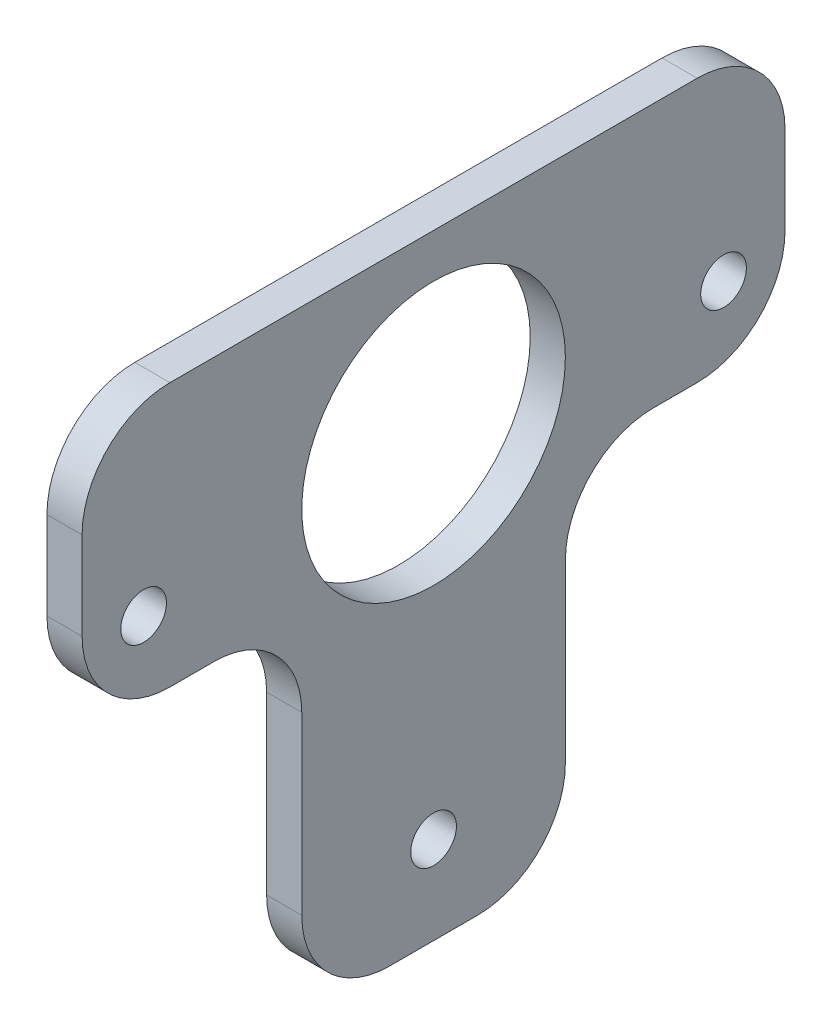
ISO-10303-21;
HEADER;
FILE_DESCRIPTION(('STEP AP214'),'2;1');
FILE_NAME('part.step','',(''),(''),'','','');
FILE_SCHEMA(('AUTOMOTIVE_DESIGN { 1 0 10303 214 1 1 1 1 }'));
ENDSEC;
DATA;
#1=APPLICATION_CONTEXT('core data for automotive mechanical design processes');
#2=APPLICATION_PROTOCOL_DEFINITION('international standard','automotive_design',2000,#1);
#3=PRODUCT_CONTEXT('',#1,'mechanical');
#4=PRODUCT('Part','Part','',(#3));
#5=PRODUCT_RELATED_PRODUCT_CATEGORY('part','',(#4));
#6=PRODUCT_DEFINITION_FORMATION('','',#4);
#7=PRODUCT_DEFINITION_CONTEXT('part definition',#1,'design');
#8=PRODUCT_DEFINITION('design','',#6,#7);
#9=PRODUCT_DEFINITION_SHAPE('','',#8);
#10=(LENGTH_UNIT() NAMED_UNIT(*) SI_UNIT(.MILLI.,.METRE.));
#11=(NAMED_UNIT(*) PLANE_ANGLE_UNIT() SI_UNIT($,.RADIAN.));
#12=(NAMED_UNIT(*) SI_UNIT($,.STERADIAN.) SOLID_ANGLE_UNIT());
#13=UNCERTAINTY_MEASURE_WITH_UNIT(LENGTH_MEASURE(1.E-05),#10,'distance_accuracy_value','');
#14=(GEOMETRIC_REPRESENTATION_CONTEXT(3) GLOBAL_UNCERTAINTY_ASSIGNED_CONTEXT((#13)) GLOBAL_UNIT_ASSIGNED_CONTEXT((#10,
#11,#12)) REPRESENTATION_CONTEXT('',''));
#15=CARTESIAN_POINT('',(0.,0.,0.));
#16=DIRECTION('',(0.,0.,1.));
#17=DIRECTION('',(1.,0.,0.));
#18=AXIS2_PLACEMENT_3D('',#15,#16,#17);
#19=CARTESIAN_POINT('',(4.,15.,40.));
#20=DIRECTION('',(0.,0.,-1.));
#21=DIRECTION('',(0.,1.,0.));
#22=AXIS2_PLACEMENT_3D('',#19,#20,#21);
#23=PLANE('',#22);
#24=DIRECTION('',(0.,-1.,0.));
#25=VECTOR('',#24,1.);
#26=CARTESIAN_POINT('',(0.,15.,40.));
#27=LINE('',#26,#25);
#28=CARTESIAN_POINT('',(0.,4.99999999999999,40.));
#29=VERTEX_POINT('',#28);
#30=CARTESIAN_POINT('',(0.,-5.,40.));
#31=VERTEX_POINT('',#30);
#32=EDGE_CURVE('E201',#29,#31,#27,.T.);
#33=ORIENTED_EDGE('',*,*,#32,.T.);
#34=DIRECTION('',(-1.,0.,0.));
#35=VECTOR('',#34,1.);
#36=CARTESIAN_POINT('',(4.,-5.,40.));
#37=LINE('',#36,#35);
#38=CARTESIAN_POINT('',(4.,-5.,40.));
#39=VERTEX_POINT('',#38);
#40=EDGE_CURVE('E252',#31,#39,#37,.F.);
#41=ORIENTED_EDGE('',*,*,#40,.T.);
#42=DIRECTION('',(0.,-1.,0.));
#43=VECTOR('',#42,1.);
#44=CARTESIAN_POINT('',(4.,15.,40.));
#45=LINE('',#44,#43);
#46=CARTESIAN_POINT('',(4.,4.99999999999999,40.));
#47=VERTEX_POINT('',#46);
#48=EDGE_CURVE('E187',#47,#39,#45,.T.);
#49=ORIENTED_EDGE('',*,*,#48,.F.);
#50=DIRECTION('',(-1.,0.,0.));
#51=VECTOR('',#50,1.);
#52=CARTESIAN_POINT('',(4.,4.99999999999999,40.));
#53=LINE('',#52,#51);
#54=EDGE_CURVE('E249',#47,#29,#53,.T.);
#55=ORIENTED_EDGE('',*,*,#54,.T.);
#56=EDGE_LOOP('',(#33,#41,#49,#55));
#57=FACE_BOUND('',#56,.T.);
#58=ADVANCED_FACE('F35',(#57),#23,.F.);
#59=CARTESIAN_POINT('',(4.,-15.,40.));
#60=DIRECTION('',(0.,1.,0.));
#61=DIRECTION('',(0.,0.,1.));
#62=AXIS2_PLACEMENT_3D('',#59,#60,#61);
#63=PLANE('',#62);
#64=DIRECTION('',(0.,0.,-1.));
#65=VECTOR('',#64,1.);
#66=CARTESIAN_POINT('',(0.,-15.,40.));
#67=LINE('',#66,#65);
#68=CARTESIAN_POINT('',(0.,-15.,30.));
#69=VERTEX_POINT('',#68);
#70=CARTESIAN_POINT('',(0.,-15.,25.));
#71=VERTEX_POINT('',#70);
#72=EDGE_CURVE('E260',#69,#71,#67,.T.);
#73=ORIENTED_EDGE('',*,*,#72,.T.);
#74=DIRECTION('',(-1.,0.,0.));
#75=VECTOR('',#74,1.);
#76=CARTESIAN_POINT('',(4.,-15.,25.));
#77=LINE('',#76,#75);
#78=CARTESIAN_POINT('',(4.,-15.,25.));
#79=VERTEX_POINT('',#78);
#80=EDGE_CURVE('E247',#71,#79,#77,.F.);
#81=ORIENTED_EDGE('',*,*,#80,.T.);
#82=DIRECTION('',(0.,0.,-1.));
#83=VECTOR('',#82,1.);
#84=CARTESIAN_POINT('',(4.,-15.,40.));
#85=LINE('',#84,#83);
#86=CARTESIAN_POINT('',(4.,-15.,30.));
#87=VERTEX_POINT('',#86);
#88=EDGE_CURVE('E279',#87,#79,#85,.T.);
#89=ORIENTED_EDGE('',*,*,#88,.F.);
#90=DIRECTION('',(-1.,0.,0.));
#91=VECTOR('',#90,1.);
#92=CARTESIAN_POINT('',(4.,-15.,30.));
#93=LINE('',#92,#91);
#94=EDGE_CURVE('E244',#87,#69,#93,.T.);
#95=ORIENTED_EDGE('',*,*,#94,.T.);
#96=EDGE_LOOP('',(#73,#81,#89,#95));
#97=FACE_BOUND('',#96,.T.);
#98=ADVANCED_FACE('F267',(#97),#63,.F.);
#99=CARTESIAN_POINT('',(4.,-15.,15.));
#100=DIRECTION('',(0.,0.,-1.));
#101=DIRECTION('',(-1.,0.,0.));
#102=AXIS2_PLACEMENT_3D('',#99,#100,#101);
#103=PLANE('',#102);
#104=DIRECTION('',(0.,-1.,0.));
#105=VECTOR('',#104,1.);
#106=CARTESIAN_POINT('',(0.,-15.,15.));
#107=LINE('',#106,#105);
#108=CARTESIAN_POINT('',(0.,-25.,15.));
#109=VERTEX_POINT('',#108);
#110=CARTESIAN_POINT('',(0.,-45.,15.));
#111=VERTEX_POINT('',#110);
#112=EDGE_CURVE('E262',#109,#111,#107,.T.);
#113=ORIENTED_EDGE('',*,*,#112,.T.);
#114=DIRECTION('',(-1.,0.,0.));
#115=VECTOR('',#114,1.);
#116=CARTESIAN_POINT('',(4.,-45.,15.));
#117=LINE('',#116,#115);
#118=CARTESIAN_POINT('',(4.,-45.,15.));
#119=VERTEX_POINT('',#118);
#120=EDGE_CURVE('E242',#111,#119,#117,.F.);
#121=ORIENTED_EDGE('',*,*,#120,.T.);
#122=DIRECTION('',(0.,-1.,0.));
#123=VECTOR('',#122,1.);
#124=CARTESIAN_POINT('',(4.,-15.,15.));
#125=LINE('',#124,#123);
#126=CARTESIAN_POINT('',(4.,-25.,15.));
#127=VERTEX_POINT('',#126);
#128=EDGE_CURVE('E277',#127,#119,#125,.T.);
#129=ORIENTED_EDGE('',*,*,#128,.F.);
#130=DIRECTION('',(-1.,0.,0.));
#131=VECTOR('',#130,1.);
#132=CARTESIAN_POINT('',(0.,-25.,15.));
#133=LINE('',#132,#131);
#134=EDGE_CURVE('E239',#127,#109,#133,.T.);
#135=ORIENTED_EDGE('',*,*,#134,.T.);
#136=EDGE_LOOP('',(#113,#121,#129,#135));
#137=FACE_BOUND('',#136,.T.);
#138=ADVANCED_FACE('F281',(#137),#103,.F.);
#139=CARTESIAN_POINT('',(4.,-55.,15.));
#140=DIRECTION('',(0.,1.,0.));
#141=DIRECTION('',(0.,0.,1.));
#142=AXIS2_PLACEMENT_3D('',#139,#140,#141);
#143=PLANE('',#142);
#144=DIRECTION('',(0.,0.,-1.));
#145=VECTOR('',#144,1.);
#146=CARTESIAN_POINT('',(0.,-55.,15.));
#147=LINE('',#146,#145);
#148=CARTESIAN_POINT('',(0.,-55.,4.99999999999999));
#149=VERTEX_POINT('',#148);
#150=CARTESIAN_POINT('',(0.,-55.,-5.00000000000001));
#151=VERTEX_POINT('',#150);
#152=EDGE_CURVE('E182',#149,#151,#147,.T.);
#153=ORIENTED_EDGE('',*,*,#152,.T.);
#154=DIRECTION('',(-1.,0.,0.));
#155=VECTOR('',#154,1.);
#156=CARTESIAN_POINT('',(4.,-55.,-5.00000000000001));
#157=LINE('',#156,#155);
#158=CARTESIAN_POINT('',(4.,-55.,-5.00000000000001));
#159=VERTEX_POINT('',#158);
#160=EDGE_CURVE('E237',#151,#159,#157,.F.);
#161=ORIENTED_EDGE('',*,*,#160,.T.);
#162=DIRECTION('',(0.,0.,-1.));
#163=VECTOR('',#162,1.);
#164=CARTESIAN_POINT('',(4.,-55.,15.));
#165=LINE('',#164,#163);
#166=CARTESIAN_POINT('',(4.,-55.,4.99999999999999));
#167=VERTEX_POINT('',#166);
#168=EDGE_CURVE('E283',#167,#159,#165,.T.);
#169=ORIENTED_EDGE('',*,*,#168,.F.);
#170=DIRECTION('',(-1.,0.,0.));
#171=VECTOR('',#170,1.);
#172=CARTESIAN_POINT('',(4.,-55.,4.99999999999999));
#173=LINE('',#172,#171);
#174=EDGE_CURVE('E234',#167,#149,#173,.T.);
#175=ORIENTED_EDGE('',*,*,#174,.T.);
#176=EDGE_LOOP('',(#153,#161,#169,#175));
#177=FACE_BOUND('',#176,.T.);
#178=ADVANCED_FACE('F303',(#177),#143,.F.);
#179=CARTESIAN_POINT('',(4.,-55.,-15.));
#180=DIRECTION('',(0.,0.,1.));
#181=DIRECTION('',(1.,0.,0.));
#182=AXIS2_PLACEMENT_3D('',#179,#180,#181);
#183=PLANE('',#182);
#184=DIRECTION('',(0.,1.,0.));
#185=VECTOR('',#184,1.);
#186=CARTESIAN_POINT('',(0.,-55.,-15.));
#187=LINE('',#186,#185);
#188=CARTESIAN_POINT('',(0.,-45.,-15.));
#189=VERTEX_POINT('',#188);
#190=CARTESIAN_POINT('',(0.,-25.,-15.));
#191=VERTEX_POINT('',#190);
#192=EDGE_CURVE('E177',#189,#191,#187,.T.);
#193=ORIENTED_EDGE('',*,*,#192,.T.);
#194=DIRECTION('',(-1.,0.,0.));
#195=VECTOR('',#194,1.);
#196=CARTESIAN_POINT('',(4.,-25.,-15.));
#197=LINE('',#196,#195);
#198=CARTESIAN_POINT('',(4.,-25.,-15.));
#199=VERTEX_POINT('',#198);
#200=EDGE_CURVE('E154',#191,#199,#197,.F.);
#201=ORIENTED_EDGE('',*,*,#200,.T.);
#202=DIRECTION('',(0.,1.,0.));
#203=VECTOR('',#202,1.);
#204=CARTESIAN_POINT('',(4.,-55.,-15.));
#205=LINE('',#204,#203);
#206=CARTESIAN_POINT('',(4.,-45.,-15.));
#207=VERTEX_POINT('',#206);
#208=EDGE_CURVE('E286',#207,#199,#205,.T.);
#209=ORIENTED_EDGE('',*,*,#208,.F.);
#210=DIRECTION('',(-1.,0.,0.));
#211=VECTOR('',#210,1.);
#212=CARTESIAN_POINT('',(4.,-45.,-15.));
#213=LINE('',#212,#211);
#214=EDGE_CURVE('E170',#207,#189,#213,.T.);
#215=ORIENTED_EDGE('',*,*,#214,.T.);
#216=EDGE_LOOP('',(#193,#201,#209,#215));
#217=FACE_BOUND('',#216,.T.);
#218=ADVANCED_FACE('F312',(#217),#183,.F.);
#219=CARTESIAN_POINT('',(4.,-15.,-15.));
#220=DIRECTION('',(0.,1.,0.));
#221=DIRECTION('',(0.,0.,1.));
#222=AXIS2_PLACEMENT_3D('',#219,#220,#221);
#223=PLANE('',#222);
#224=DIRECTION('',(0.,0.,-1.));
#225=VECTOR('',#224,1.);
#226=CARTESIAN_POINT('',(4.,-15.,-15.));
#227=LINE('',#226,#225);
#228=CARTESIAN_POINT('',(4.,-15.,-25.));
#229=VERTEX_POINT('',#228);
#230=CARTESIAN_POINT('',(4.,-15.,-30.));
#231=VERTEX_POINT('',#230);
#232=EDGE_CURVE('E169',#229,#231,#227,.T.);
#233=ORIENTED_EDGE('',*,*,#232,.F.);
#234=DIRECTION('',(-1.,0.,0.));
#235=VECTOR('',#234,1.);
#236=CARTESIAN_POINT('',(0.,-15.,-25.));
#237=LINE('',#236,#235);
#238=CARTESIAN_POINT('',(0.,-15.,-25.));
#239=VERTEX_POINT('',#238);
#240=EDGE_CURVE('E153',#229,#239,#237,.T.);
#241=ORIENTED_EDGE('',*,*,#240,.T.);
#242=DIRECTION('',(0.,0.,-1.));
#243=VECTOR('',#242,1.);
#244=CARTESIAN_POINT('',(0.,-15.,-15.));
#245=LINE('',#244,#243);
#246=CARTESIAN_POINT('',(0.,-15.,-30.));
#247=VERTEX_POINT('',#246);
#248=EDGE_CURVE('E166',#239,#247,#245,.T.);
#249=ORIENTED_EDGE('',*,*,#248,.T.);
#250=DIRECTION('',(-1.,0.,0.));
#251=VECTOR('',#250,1.);
#252=CARTESIAN_POINT('',(4.,-15.,-30.));
#253=LINE('',#252,#251);
#254=EDGE_CURVE('E171',#247,#231,#253,.F.);
#255=ORIENTED_EDGE('',*,*,#254,.T.);
#256=EDGE_LOOP('',(#233,#241,#249,#255));
#257=FACE_BOUND('',#256,.T.);
#258=ADVANCED_FACE('F165',(#257),#223,.F.);
#259=CARTESIAN_POINT('',(4.,15.,-40.));
#260=DIRECTION('',(0.,0.,1.));
#261=DIRECTION('',(0.,-1.,0.));
#262=AXIS2_PLACEMENT_3D('',#259,#260,#261);
#263=PLANE('',#262);
#264=DIRECTION('',(0.,1.,0.));
#265=VECTOR('',#264,1.);
#266=CARTESIAN_POINT('',(4.,15.,-40.));
#267=LINE('',#266,#265);
#268=CARTESIAN_POINT('',(4.,-4.99999999999999,-40.));
#269=VERTEX_POINT('',#268);
#270=CARTESIAN_POINT('',(4.,5.00000000000001,-40.));
#271=VERTEX_POINT('',#270);
#272=EDGE_CURVE('E294',#269,#271,#267,.T.);
#273=ORIENTED_EDGE('',*,*,#272,.F.);
#274=DIRECTION('',(-1.,0.,0.));
#275=VECTOR('',#274,1.);
#276=CARTESIAN_POINT('',(4.,-4.99999999999999,-40.));
#277=LINE('',#276,#275);
#278=CARTESIAN_POINT('',(0.,-4.99999999999999,-40.));
#279=VERTEX_POINT('',#278);
#280=EDGE_CURVE('E209',#269,#279,#277,.T.);
#281=ORIENTED_EDGE('',*,*,#280,.T.);
#282=DIRECTION('',(0.,1.,0.));
#283=VECTOR('',#282,1.);
#284=CARTESIAN_POINT('',(0.,15.,-40.));
#285=LINE('',#284,#283);
#286=CARTESIAN_POINT('',(0.,5.00000000000001,-40.));
#287=VERTEX_POINT('',#286);
#288=EDGE_CURVE('E176',#279,#287,#285,.T.);
#289=ORIENTED_EDGE('',*,*,#288,.T.);
#290=DIRECTION('',(-1.,0.,0.));
#291=VECTOR('',#290,1.);
#292=CARTESIAN_POINT('',(4.,5.00000000000001,-40.));
#293=LINE('',#292,#291);
#294=EDGE_CURVE('E207',#287,#271,#293,.F.);
#295=ORIENTED_EDGE('',*,*,#294,.T.);
#296=EDGE_LOOP('',(#273,#281,#289,#295));
#297=FACE_BOUND('',#296,.T.);
#298=ADVANCED_FACE('F319',(#297),#263,.F.);
#299=CARTESIAN_POINT('',(4.,15.,-40.));
#300=DIRECTION('',(0.,-1.,0.));
#301=DIRECTION('',(0.,0.,-1.));
#302=AXIS2_PLACEMENT_3D('',#299,#300,#301);
#303=PLANE('',#302);
#304=DIRECTION('',(0.,0.,1.));
#305=VECTOR('',#304,1.);
#306=CARTESIAN_POINT('',(4.,15.,-40.));
#307=LINE('',#306,#305);
#308=CARTESIAN_POINT('',(4.,15.,-30.));
#309=VERTEX_POINT('',#308);
#310=CARTESIAN_POINT('',(4.,15.,30.));
#311=VERTEX_POINT('',#310);
#312=EDGE_CURVE('E202',#309,#311,#307,.T.);
#313=ORIENTED_EDGE('',*,*,#312,.F.);
#314=DIRECTION('',(-1.,0.,0.));
#315=VECTOR('',#314,1.);
#316=CARTESIAN_POINT('',(4.,15.,-30.));
#317=LINE('',#316,#315);
#318=CARTESIAN_POINT('',(0.,15.,-30.));
#319=VERTEX_POINT('',#318);
#320=EDGE_CURVE('E160',#309,#319,#317,.T.);
#321=ORIENTED_EDGE('',*,*,#320,.T.);
#322=DIRECTION('',(0.,0.,1.));
#323=VECTOR('',#322,1.);
#324=CARTESIAN_POINT('',(0.,15.,-40.));
#325=LINE('',#324,#323);
#326=CARTESIAN_POINT('',(0.,15.,30.));
#327=VERTEX_POINT('',#326);
#328=EDGE_CURVE('E180',#319,#327,#325,.T.);
#329=ORIENTED_EDGE('',*,*,#328,.T.);
#330=DIRECTION('',(-1.,0.,0.));
#331=VECTOR('',#330,1.);
#332=CARTESIAN_POINT('',(4.,15.,30.));
#333=LINE('',#332,#331);
#334=EDGE_CURVE('E50',#327,#311,#333,.F.);
#335=ORIENTED_EDGE('',*,*,#334,.T.);
#336=EDGE_LOOP('',(#313,#321,#329,#335));
#337=FACE_BOUND('',#336,.T.);
#338=ADVANCED_FACE('F359',(#337),#303,.F.);
#339=CARTESIAN_POINT('',(4.,0.,0.));
#340=DIRECTION('',(1.,0.,0.));
#341=DIRECTION('',(0.,0.,-1.));
#342=AXIS2_PLACEMENT_3D('',#339,#340,#341);
#343=PLANE('',#342);
#344=CARTESIAN_POINT('',(4.,-6.49999999999999,-33.));
#345=DIRECTION('',(1.,0.,0.));
#346=DIRECTION('',(0.,0.,-1.));
#347=AXIS2_PLACEMENT_3D('',#344,#345,#346);
#348=CIRCLE('',#347,2.6);
#349=CARTESIAN_POINT('',(4.,-6.49999999999999,-35.6));
#350=VERTEX_POINT('',#349);
#351=EDGE_CURVE('E371',#350,#350,#348,.T.);
#352=ORIENTED_EDGE('',*,*,#351,.F.);
#353=EDGE_LOOP('',(#352));
#354=FACE_BOUND('',#353,.T.);
#355=CARTESIAN_POINT('',(4.,-45.,0.));
#356=DIRECTION('',(1.,0.,0.));
#357=DIRECTION('',(0.,0.,-1.));
#358=AXIS2_PLACEMENT_3D('',#355,#356,#357);
#359=CIRCLE('',#358,2.6);
#360=CARTESIAN_POINT('',(4.,-45.,-2.6));
#361=VERTEX_POINT('',#360);
#362=EDGE_CURVE('E374',#361,#361,#359,.T.);
#363=ORIENTED_EDGE('',*,*,#362,.F.);
#364=EDGE_LOOP('',(#363));
#365=FACE_BOUND('',#364,.T.);
#366=CARTESIAN_POINT('',(4.,-6.49999999999999,33.));
#367=DIRECTION('',(1.,0.,0.));
#368=DIRECTION('',(0.,0.,-1.));
#369=AXIS2_PLACEMENT_3D('',#366,#367,#368);
#370=CIRCLE('',#369,2.6);
#371=CARTESIAN_POINT('',(4.,-6.49999999999999,30.4));
#372=VERTEX_POINT('',#371);
#373=EDGE_CURVE('E370',#372,#372,#370,.T.);
#374=ORIENTED_EDGE('',*,*,#373,.F.);
#375=EDGE_LOOP('',(#374));
#376=FACE_BOUND('',#375,.T.);
#377=CARTESIAN_POINT('',(4.,-4.99999999999999,0.));
#378=DIRECTION('',(1.,0.,0.));
#379=DIRECTION('',(0.,0.,-1.));
#380=AXIS2_PLACEMENT_3D('',#377,#378,#379);
#381=CIRCLE('',#380,15.);
#382=CARTESIAN_POINT('',(4.,-4.99999999999999,-15.));
#383=VERTEX_POINT('',#382);
#384=EDGE_CURVE('E192',#383,#383,#381,.T.);
#385=ORIENTED_EDGE('',*,*,#384,.F.);
#386=EDGE_LOOP('',(#385));
#387=FACE_BOUND('',#386,.T.);
#388=ORIENTED_EDGE('',*,*,#232,.T.);
#389=CARTESIAN_POINT('',(4.,-5.,-30.));
#390=DIRECTION('',(1.,0.,0.));
#391=DIRECTION('',(0.,0.,-1.));
#392=AXIS2_PLACEMENT_3D('',#389,#390,#391);
#393=CIRCLE('',#392,10.);
#394=EDGE_CURVE('E232',#231,#269,#393,.T.);
#395=ORIENTED_EDGE('',*,*,#394,.T.);
#396=ORIENTED_EDGE('',*,*,#272,.T.);
#397=CARTESIAN_POINT('',(4.,5.00000000000001,-30.));
#398=DIRECTION('',(1.,0.,0.));
#399=DIRECTION('',(0.,0.,-1.));
#400=AXIS2_PLACEMENT_3D('',#397,#398,#399);
#401=CIRCLE('',#400,10.);
#402=EDGE_CURVE('E57',#271,#309,#401,.T.);
#403=ORIENTED_EDGE('',*,*,#402,.T.);
#404=ORIENTED_EDGE('',*,*,#312,.T.);
#405=CARTESIAN_POINT('',(4.,5.,30.));
#406=DIRECTION('',(1.,0.,0.));
#407=DIRECTION('',(0.,0.,-1.));
#408=AXIS2_PLACEMENT_3D('',#405,#406,#407);
#409=CIRCLE('',#408,10.);
#410=EDGE_CURVE('E223',#311,#47,#409,.T.);
#411=ORIENTED_EDGE('',*,*,#410,.T.);
#412=ORIENTED_EDGE('',*,*,#48,.T.);
#413=CARTESIAN_POINT('',(4.,-5.,30.));
#414=DIRECTION('',(1.,0.,0.));
#415=DIRECTION('',(0.,0.,-1.));
#416=AXIS2_PLACEMENT_3D('',#413,#414,#415);
#417=CIRCLE('',#416,10.);
#418=EDGE_CURVE('E226',#39,#87,#417,.T.);
#419=ORIENTED_EDGE('',*,*,#418,.T.);
#420=ORIENTED_EDGE('',*,*,#88,.T.);
#421=CARTESIAN_POINT('',(4.,-25.,25.));
#422=DIRECTION('',(1.,0.,0.));
#423=DIRECTION('',(0.,0.,-1.));
#424=AXIS2_PLACEMENT_3D('',#421,#422,#423);
#425=CIRCLE('',#424,10.);
#426=EDGE_CURVE('E11',#79,#127,#425,.F.);
#427=ORIENTED_EDGE('',*,*,#426,.T.);
#428=ORIENTED_EDGE('',*,*,#128,.T.);
#429=CARTESIAN_POINT('',(4.,-45.,4.99999999999999));
#430=DIRECTION('',(1.,0.,0.));
#431=DIRECTION('',(0.,0.,-1.));
#432=AXIS2_PLACEMENT_3D('',#429,#430,#431);
#433=CIRCLE('',#432,10.);
#434=EDGE_CURVE('E228',#119,#167,#433,.T.);
#435=ORIENTED_EDGE('',*,*,#434,.T.);
#436=ORIENTED_EDGE('',*,*,#168,.T.);
#437=CARTESIAN_POINT('',(4.,-45.,-5.00000000000001));
#438=DIRECTION('',(1.,0.,0.));
#439=DIRECTION('',(0.,0.,-1.));
#440=AXIS2_PLACEMENT_3D('',#437,#438,#439);
#441=CIRCLE('',#440,10.);
#442=EDGE_CURVE('E230',#159,#207,#441,.T.);
#443=ORIENTED_EDGE('',*,*,#442,.T.);
#444=ORIENTED_EDGE('',*,*,#208,.T.);
#445=CARTESIAN_POINT('',(4.,-25.,-25.));
#446=DIRECTION('',(1.,0.,0.));
#447=DIRECTION('',(0.,0.,-1.));
#448=AXIS2_PLACEMENT_3D('',#445,#446,#447);
#449=CIRCLE('',#448,10.);
#450=EDGE_CURVE('E159',#199,#229,#449,.F.);
#451=ORIENTED_EDGE('',*,*,#450,.T.);
#452=EDGE_LOOP('',(#388,#395,#396,#403,#404,#411,#412,#419,#420,#427,#428,#435,#436,#443,#444,#451));
#453=FACE_BOUND('',#452,.T.);
#454=ADVANCED_FACE('F276',(#354,#365,#376,#387,#453),#343,.T.);
#455=CARTESIAN_POINT('',(0.,0.,0.));
#456=DIRECTION('',(1.,0.,0.));
#457=DIRECTION('',(0.,0.,-1.));
#458=AXIS2_PLACEMENT_3D('',#455,#456,#457);
#459=PLANE('',#458);
#460=CARTESIAN_POINT('',(0.,-6.49999999999999,-33.));
#461=DIRECTION('',(1.,0.,0.));
#462=DIRECTION('',(0.,0.,-1.));
#463=AXIS2_PLACEMENT_3D('',#460,#461,#462);
#464=CIRCLE('',#463,2.6);
#465=CARTESIAN_POINT('',(0.,-6.49999999999999,-35.6));
#466=VERTEX_POINT('',#465);
#467=EDGE_CURVE('E198',#466,#466,#464,.T.);
#468=ORIENTED_EDGE('',*,*,#467,.T.);
#469=EDGE_LOOP('',(#468));
#470=FACE_BOUND('',#469,.T.);
#471=CARTESIAN_POINT('',(0.,-45.,0.));
#472=DIRECTION('',(1.,0.,0.));
#473=DIRECTION('',(0.,0.,-1.));
#474=AXIS2_PLACEMENT_3D('',#471,#472,#473);
#475=CIRCLE('',#474,2.6);
#476=CARTESIAN_POINT('',(0.,-45.,-2.6));
#477=VERTEX_POINT('',#476);
#478=EDGE_CURVE('E195',#477,#477,#475,.T.);
#479=ORIENTED_EDGE('',*,*,#478,.T.);
#480=EDGE_LOOP('',(#479));
#481=FACE_BOUND('',#480,.T.);
#482=CARTESIAN_POINT('',(0.,-6.49999999999999,33.));
#483=DIRECTION('',(1.,0.,0.));
#484=DIRECTION('',(0.,0.,-1.));
#485=AXIS2_PLACEMENT_3D('',#482,#483,#484);
#486=CIRCLE('',#485,2.6);
#487=CARTESIAN_POINT('',(0.,-6.49999999999999,30.4));
#488=VERTEX_POINT('',#487);
#489=EDGE_CURVE('E191',#488,#488,#486,.T.);
#490=ORIENTED_EDGE('',*,*,#489,.T.);
#491=EDGE_LOOP('',(#490));
#492=FACE_BOUND('',#491,.T.);
#493=CARTESIAN_POINT('',(0.,-4.99999999999999,0.));
#494=DIRECTION('',(1.,0.,0.));
#495=DIRECTION('',(0.,0.,-1.));
#496=AXIS2_PLACEMENT_3D('',#493,#494,#495);
#497=CIRCLE('',#496,15.);
#498=CARTESIAN_POINT('',(0.,-4.99999999999999,-15.));
#499=VERTEX_POINT('',#498);
#500=EDGE_CURVE('E188',#499,#499,#497,.T.);
#501=ORIENTED_EDGE('',*,*,#500,.T.);
#502=EDGE_LOOP('',(#501));
#503=FACE_BOUND('',#502,.T.);
#504=ORIENTED_EDGE('',*,*,#288,.F.);
#505=CARTESIAN_POINT('',(0.,-5.,-30.));
#506=DIRECTION('',(1.,0.,0.));
#507=DIRECTION('',(0.,0.,-1.));
#508=AXIS2_PLACEMENT_3D('',#505,#506,#507);
#509=CIRCLE('',#508,10.);
#510=EDGE_CURVE('E175',#279,#247,#509,.F.);
#511=ORIENTED_EDGE('',*,*,#510,.T.);
#512=ORIENTED_EDGE('',*,*,#248,.F.);
#513=CARTESIAN_POINT('',(0.,-25.,-25.));
#514=DIRECTION('',(1.,0.,0.));
#515=DIRECTION('',(0.,0.,-1.));
#516=AXIS2_PLACEMENT_3D('',#513,#514,#515);
#517=CIRCLE('',#516,10.);
#518=EDGE_CURVE('E149',#239,#191,#517,.T.);
#519=ORIENTED_EDGE('',*,*,#518,.T.);
#520=ORIENTED_EDGE('',*,*,#192,.F.);
#521=CARTESIAN_POINT('',(0.,-45.,-5.00000000000001));
#522=DIRECTION('',(1.,0.,0.));
#523=DIRECTION('',(0.,0.,-1.));
#524=AXIS2_PLACEMENT_3D('',#521,#522,#523);
#525=CIRCLE('',#524,10.);
#526=EDGE_CURVE('E220',#189,#151,#525,.F.);
#527=ORIENTED_EDGE('',*,*,#526,.T.);
#528=ORIENTED_EDGE('',*,*,#152,.F.);
#529=CARTESIAN_POINT('',(0.,-45.,4.99999999999999));
#530=DIRECTION('',(1.,0.,0.));
#531=DIRECTION('',(0.,0.,-1.));
#532=AXIS2_PLACEMENT_3D('',#529,#530,#531);
#533=CIRCLE('',#532,10.);
#534=EDGE_CURVE('E218',#149,#111,#533,.F.);
#535=ORIENTED_EDGE('',*,*,#534,.T.);
#536=ORIENTED_EDGE('',*,*,#112,.F.);
#537=CARTESIAN_POINT('',(0.,-25.,25.));
#538=DIRECTION('',(1.,0.,0.));
#539=DIRECTION('',(0.,0.,-1.));
#540=AXIS2_PLACEMENT_3D('',#537,#538,#539);
#541=CIRCLE('',#540,10.);
#542=EDGE_CURVE('E43',#109,#71,#541,.T.);
#543=ORIENTED_EDGE('',*,*,#542,.T.);
#544=ORIENTED_EDGE('',*,*,#72,.F.);
#545=CARTESIAN_POINT('',(0.,-5.,30.));
#546=DIRECTION('',(1.,0.,0.));
#547=DIRECTION('',(0.,0.,-1.));
#548=AXIS2_PLACEMENT_3D('',#545,#546,#547);
#549=CIRCLE('',#548,10.);
#550=EDGE_CURVE('E216',#69,#31,#549,.F.);
#551=ORIENTED_EDGE('',*,*,#550,.T.);
#552=ORIENTED_EDGE('',*,*,#32,.F.);
#553=CARTESIAN_POINT('',(0.,5.,30.));
#554=DIRECTION('',(1.,0.,0.));
#555=DIRECTION('',(0.,0.,-1.));
#556=AXIS2_PLACEMENT_3D('',#553,#554,#555);
#557=CIRCLE('',#556,10.);
#558=EDGE_CURVE('E212',#29,#327,#557,.F.);
#559=ORIENTED_EDGE('',*,*,#558,.T.);
#560=ORIENTED_EDGE('',*,*,#328,.F.);
#561=CARTESIAN_POINT('',(0.,5.00000000000001,-30.));
#562=DIRECTION('',(1.,0.,0.));
#563=DIRECTION('',(0.,0.,-1.));
#564=AXIS2_PLACEMENT_3D('',#561,#562,#563);
#565=CIRCLE('',#564,10.);
#566=EDGE_CURVE('E214',#319,#287,#565,.F.);
#567=ORIENTED_EDGE('',*,*,#566,.T.);
#568=EDGE_LOOP('',(#504,#511,#512,#519,#520,#527,#528,#535,#536,#543,#544,#551,#552,#559,#560,#567));
#569=FACE_BOUND('',#568,.T.);
#570=ADVANCED_FACE('F174',(#470,#481,#492,#503,#569),#459,.F.);
#571=CARTESIAN_POINT('',(-1.,-4.99999999999999,0.));
#572=DIRECTION('',(1.,0.,0.));
#573=DIRECTION('',(0.,0.,-1.));
#574=AXIS2_PLACEMENT_3D('',#571,#572,#573);
#575=CYLINDRICAL_SURFACE('',#574,15.);
#576=ORIENTED_EDGE('',*,*,#384,.T.);
#577=EDGE_LOOP('',(#576));
#578=FACE_BOUND('',#577,.T.);
#579=ORIENTED_EDGE('',*,*,#500,.F.);
#580=EDGE_LOOP('',(#579));
#581=FACE_BOUND('',#580,.T.);
#582=ADVANCED_FACE('F389',(#578,#581),#575,.F.);
#583=CARTESIAN_POINT('',(-1.,-6.49999999999999,33.));
#584=DIRECTION('',(1.,0.,0.));
#585=DIRECTION('',(0.,0.,-1.));
#586=AXIS2_PLACEMENT_3D('',#583,#584,#585);
#587=CYLINDRICAL_SURFACE('',#586,2.6);
#588=ORIENTED_EDGE('',*,*,#373,.T.);
#589=EDGE_LOOP('',(#588));
#590=FACE_BOUND('',#589,.T.);
#591=ORIENTED_EDGE('',*,*,#489,.F.);
#592=EDGE_LOOP('',(#591));
#593=FACE_BOUND('',#592,.T.);
#594=ADVANCED_FACE('F380',(#590,#593),#587,.F.);
#595=CARTESIAN_POINT('',(-1.,-45.,0.));
#596=DIRECTION('',(1.,0.,0.));
#597=DIRECTION('',(0.,0.,-1.));
#598=AXIS2_PLACEMENT_3D('',#595,#596,#597);
#599=CYLINDRICAL_SURFACE('',#598,2.6);
#600=ORIENTED_EDGE('',*,*,#362,.T.);
#601=EDGE_LOOP('',(#600));
#602=FACE_BOUND('',#601,.T.);
#603=ORIENTED_EDGE('',*,*,#478,.F.);
#604=EDGE_LOOP('',(#603));
#605=FACE_BOUND('',#604,.T.);
#606=ADVANCED_FACE('F481',(#602,#605),#599,.F.);
#607=CARTESIAN_POINT('',(-1.,-6.49999999999999,-33.));
#608=DIRECTION('',(1.,0.,0.));
#609=DIRECTION('',(0.,0.,-1.));
#610=AXIS2_PLACEMENT_3D('',#607,#608,#609);
#611=CYLINDRICAL_SURFACE('',#610,2.6);
#612=ORIENTED_EDGE('',*,*,#351,.T.);
#613=EDGE_LOOP('',(#612));
#614=FACE_BOUND('',#613,.T.);
#615=ORIENTED_EDGE('',*,*,#467,.F.);
#616=EDGE_LOOP('',(#615));
#617=FACE_BOUND('',#616,.T.);
#618=ADVANCED_FACE('F334',(#614,#617),#611,.F.);
#619=CARTESIAN_POINT('',(4.,-25.,-25.));
#620=DIRECTION('',(1.,0.,0.));
#621=DIRECTION('',(0.,0.,-1.));
#622=AXIS2_PLACEMENT_3D('',#619,#620,#621);
#623=CYLINDRICAL_SURFACE('',#622,10.);
#624=ORIENTED_EDGE('',*,*,#450,.F.);
#625=ORIENTED_EDGE('',*,*,#200,.F.);
#626=ORIENTED_EDGE('',*,*,#518,.F.);
#627=ORIENTED_EDGE('',*,*,#240,.F.);
#628=EDGE_LOOP('',(#624,#625,#626,#627));
#629=FACE_BOUND('',#628,.T.);
#630=ADVANCED_FACE('F152',(#629),#623,.F.);
#631=CARTESIAN_POINT('',(4.,-5.,-30.));
#632=DIRECTION('',(-1.,0.,0.));
#633=DIRECTION('',(0.,0.,1.));
#634=AXIS2_PLACEMENT_3D('',#631,#632,#633);
#635=CYLINDRICAL_SURFACE('',#634,10.);
#636=ORIENTED_EDGE('',*,*,#394,.F.);
#637=ORIENTED_EDGE('',*,*,#254,.F.);
#638=ORIENTED_EDGE('',*,*,#510,.F.);
#639=ORIENTED_EDGE('',*,*,#280,.F.);
#640=EDGE_LOOP('',(#636,#637,#638,#639));
#641=FACE_BOUND('',#640,.T.);
#642=ADVANCED_FACE('F333',(#641),#635,.T.);
#643=CARTESIAN_POINT('',(4.,-45.,-5.00000000000001));
#644=DIRECTION('',(-1.,0.,0.));
#645=DIRECTION('',(0.,0.,1.));
#646=AXIS2_PLACEMENT_3D('',#643,#644,#645);
#647=CYLINDRICAL_SURFACE('',#646,10.);
#648=ORIENTED_EDGE('',*,*,#442,.F.);
#649=ORIENTED_EDGE('',*,*,#160,.F.);
#650=ORIENTED_EDGE('',*,*,#526,.F.);
#651=ORIENTED_EDGE('',*,*,#214,.F.);
#652=EDGE_LOOP('',(#648,#649,#650,#651));
#653=FACE_BOUND('',#652,.T.);
#654=ADVANCED_FACE('F308',(#653),#647,.T.);
#655=CARTESIAN_POINT('',(4.,-45.,4.99999999999999));
#656=DIRECTION('',(-1.,0.,0.));
#657=DIRECTION('',(0.,0.,1.));
#658=AXIS2_PLACEMENT_3D('',#655,#656,#657);
#659=CYLINDRICAL_SURFACE('',#658,10.);
#660=ORIENTED_EDGE('',*,*,#434,.F.);
#661=ORIENTED_EDGE('',*,*,#120,.F.);
#662=ORIENTED_EDGE('',*,*,#534,.F.);
#663=ORIENTED_EDGE('',*,*,#174,.F.);
#664=EDGE_LOOP('',(#660,#661,#662,#663));
#665=FACE_BOUND('',#664,.T.);
#666=ADVANCED_FACE('F340',(#665),#659,.T.);
#667=CARTESIAN_POINT('',(4.,-25.,25.));
#668=DIRECTION('',(1.,0.,0.));
#669=DIRECTION('',(0.,0.,-1.));
#670=AXIS2_PLACEMENT_3D('',#667,#668,#669);
#671=CYLINDRICAL_SURFACE('',#670,10.);
#672=ORIENTED_EDGE('',*,*,#426,.F.);
#673=ORIENTED_EDGE('',*,*,#80,.F.);
#674=ORIENTED_EDGE('',*,*,#542,.F.);
#675=ORIENTED_EDGE('',*,*,#134,.F.);
#676=EDGE_LOOP('',(#672,#673,#674,#675));
#677=FACE_BOUND('',#676,.T.);
#678=ADVANCED_FACE('F273',(#677),#671,.F.);
#679=CARTESIAN_POINT('',(4.,-5.,30.));
#680=DIRECTION('',(-1.,0.,0.));
#681=DIRECTION('',(0.,0.,1.));
#682=AXIS2_PLACEMENT_3D('',#679,#680,#681);
#683=CYLINDRICAL_SURFACE('',#682,10.);
#684=ORIENTED_EDGE('',*,*,#418,.F.);
#685=ORIENTED_EDGE('',*,*,#40,.F.);
#686=ORIENTED_EDGE('',*,*,#550,.F.);
#687=ORIENTED_EDGE('',*,*,#94,.F.);
#688=EDGE_LOOP('',(#684,#685,#686,#687));
#689=FACE_BOUND('',#688,.T.);
#690=ADVANCED_FACE('F346',(#689),#683,.T.);
#691=CARTESIAN_POINT('',(4.,5.00000000000001,-30.));
#692=DIRECTION('',(-1.,0.,0.));
#693=DIRECTION('',(0.,0.,1.));
#694=AXIS2_PLACEMENT_3D('',#691,#692,#693);
#695=CYLINDRICAL_SURFACE('',#694,10.);
#696=ORIENTED_EDGE('',*,*,#402,.F.);
#697=ORIENTED_EDGE('',*,*,#294,.F.);
#698=ORIENTED_EDGE('',*,*,#566,.F.);
#699=ORIENTED_EDGE('',*,*,#320,.F.);
#700=EDGE_LOOP('',(#696,#697,#698,#699));
#701=FACE_BOUND('',#700,.T.);
#702=ADVANCED_FACE('F348',(#701),#695,.T.);
#703=CARTESIAN_POINT('',(4.,5.,30.));
#704=DIRECTION('',(-1.,0.,0.));
#705=DIRECTION('',(0.,0.,1.));
#706=AXIS2_PLACEMENT_3D('',#703,#704,#705);
#707=CYLINDRICAL_SURFACE('',#706,10.);
#708=ORIENTED_EDGE('',*,*,#410,.F.);
#709=ORIENTED_EDGE('',*,*,#334,.F.);
#710=ORIENTED_EDGE('',*,*,#558,.F.);
#711=ORIENTED_EDGE('',*,*,#54,.F.);
#712=EDGE_LOOP('',(#708,#709,#710,#711));
#713=FACE_BOUND('',#712,.T.);
#714=ADVANCED_FACE('F37',(#713),#707,.T.);
#715=CLOSED_SHELL('',(#58,#98,#138,#178,#218,#258,#298,#338,#454,#570,#582,#594,#606,#618,#630,
#642,#654,#666,#678,#690,#702,#714));
#716=MANIFOLD_SOLID_BREP('B2',#715);
#717=ADVANCED_BREP_SHAPE_REPRESENTATION('',(#18,#716),#14);
#718=SHAPE_DEFINITION_REPRESENTATION(#9,#717);
ENDSEC;
END-ISO-10303-21;
